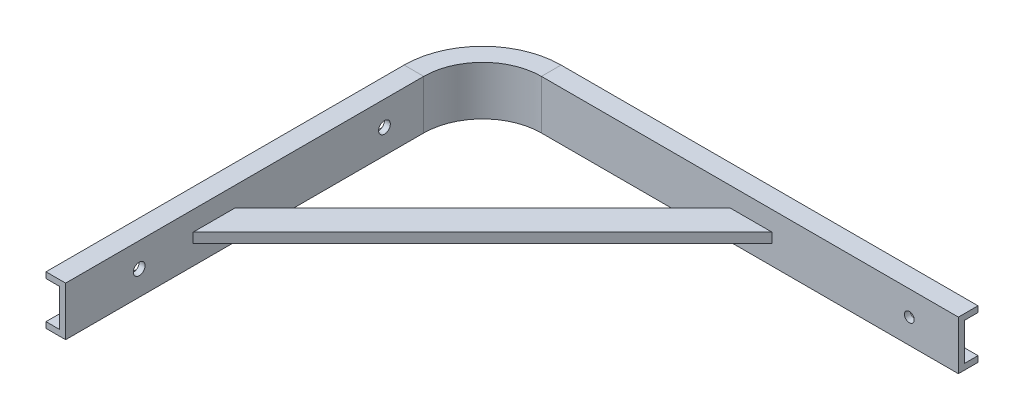
ISO-10303-21;
HEADER;
FILE_DESCRIPTION(('STEP AP214'),'2;1');
FILE_NAME('part.step','',(''),(''),'','','');
FILE_SCHEMA(('AUTOMOTIVE_DESIGN { 1 0 10303 214 1 1 1 1 }'));
ENDSEC;
DATA;
#1=APPLICATION_CONTEXT('core data for automotive mechanical design processes');
#2=APPLICATION_PROTOCOL_DEFINITION('international standard','automotive_design',2000,#1);
#3=PRODUCT_CONTEXT('',#1,'mechanical');
#4=PRODUCT('Part','Part','',(#3));
#5=PRODUCT_RELATED_PRODUCT_CATEGORY('part','',(#4));
#6=PRODUCT_DEFINITION_FORMATION('','',#4);
#7=PRODUCT_DEFINITION_CONTEXT('part definition',#1,'design');
#8=PRODUCT_DEFINITION('design','',#6,#7);
#9=PRODUCT_DEFINITION_SHAPE('','',#8);
#10=(LENGTH_UNIT() NAMED_UNIT(*) SI_UNIT(.MILLI.,.METRE.));
#11=(NAMED_UNIT(*) PLANE_ANGLE_UNIT() SI_UNIT($,.RADIAN.));
#12=(NAMED_UNIT(*) SI_UNIT($,.STERADIAN.) SOLID_ANGLE_UNIT());
#13=UNCERTAINTY_MEASURE_WITH_UNIT(LENGTH_MEASURE(1.E-05),#10,'distance_accuracy_value','');
#14=(GEOMETRIC_REPRESENTATION_CONTEXT(3) GLOBAL_UNCERTAINTY_ASSIGNED_CONTEXT((#13)) GLOBAL_UNIT_ASSIGNED_CONTEXT((#10,
#11,#12)) REPRESENTATION_CONTEXT('',''));
#15=CARTESIAN_POINT('',(0.,0.,0.));
#16=DIRECTION('',(0.,0.,1.));
#17=DIRECTION('',(1.,0.,0.));
#18=AXIS2_PLACEMENT_3D('',#15,#16,#17);
#19=CARTESIAN_POINT('',(-242.51106428109,-12.4999999999999,-227.488935718911));
#20=DIRECTION('',(-1.,0.,0.));
#21=DIRECTION('',(0.,0.,1.));
#22=AXIS2_PLACEMENT_3D('',#19,#20,#21);
#23=PLANE('',#22);
#24=CARTESIAN_POINT('',(-242.51106428109,0.,60.0000000000008));
#25=DIRECTION('',(1.,0.,0.));
#26=DIRECTION('',(0.,0.,-1.));
#27=AXIS2_PLACEMENT_3D('',#24,#25,#26);
#28=CIRCLE('',#27,3.00000000000001);
#29=CARTESIAN_POINT('',(-242.51106428109,0.,57.0000000000008));
#30=VERTEX_POINT('',#29);
#31=EDGE_CURVE('E271',#30,#30,#28,.T.);
#32=ORIENTED_EDGE('',*,*,#31,.F.);
#33=EDGE_LOOP('',(#32));
#34=FACE_BOUND('',#33,.T.);
#35=DIRECTION('',(0.,-1.,0.));
#36=VECTOR('',#35,1.);
#37=CARTESIAN_POINT('',(-242.511064281089,-12.4999999999999,40.0000000000001));
#38=LINE('',#37,#36);
#39=CARTESIAN_POINT('',(-242.511064281089,12.5,40.0000000000001));
#40=VERTEX_POINT('',#39);
#41=CARTESIAN_POINT('',(-242.511064281089,-12.5,40.0000000000001));
#42=VERTEX_POINT('',#41);
#43=EDGE_CURVE('E347',#40,#42,#38,.T.);
#44=ORIENTED_EDGE('',*,*,#43,.F.);
#45=DIRECTION('',(0.,0.,1.));
#46=VECTOR('',#45,1.);
#47=CARTESIAN_POINT('',(-242.51106428109,12.4999999999999,-227.488935718911));
#48=LINE('',#47,#46);
#49=CARTESIAN_POINT('',(-242.511064281089,12.5,222.511064281089));
#50=VERTEX_POINT('',#49);
#51=EDGE_CURVE('E329',#40,#50,#48,.T.);
#52=ORIENTED_EDGE('',*,*,#51,.T.);
#53=DIRECTION('',(0.,-1.,0.));
#54=VECTOR('',#53,1.);
#55=CARTESIAN_POINT('',(-242.511064281089,12.5,222.511064281089));
#56=LINE('',#55,#54);
#57=CARTESIAN_POINT('',(-242.511064281089,-12.5,222.511064281089));
#58=VERTEX_POINT('',#57);
#59=EDGE_CURVE('E326',#50,#58,#56,.T.);
#60=ORIENTED_EDGE('',*,*,#59,.T.);
#61=DIRECTION('',(0.,0.,-1.));
#62=VECTOR('',#61,1.);
#63=CARTESIAN_POINT('',(-242.51106428109,-12.4999999999999,-227.488935718911));
#64=LINE('',#63,#62);
#65=EDGE_CURVE('E328',#58,#42,#64,.T.);
#66=ORIENTED_EDGE('',*,*,#65,.T.);
#67=EDGE_LOOP('',(#44,#52,#60,#66));
#68=FACE_BOUND('',#67,.T.);
#69=CARTESIAN_POINT('',(-242.511064281089,0.,185.000000000001));
#70=DIRECTION('',(1.,0.,0.));
#71=DIRECTION('',(0.,0.,-1.));
#72=AXIS2_PLACEMENT_3D('',#69,#70,#71);
#73=CIRCLE('',#72,2.99999999999999);
#74=CARTESIAN_POINT('',(-242.511064281089,0.,182.000000000001));
#75=VERTEX_POINT('',#74);
#76=EDGE_CURVE('E274',#75,#75,#73,.T.);
#77=ORIENTED_EDGE('',*,*,#76,.F.);
#78=EDGE_LOOP('',(#77));
#79=FACE_BOUND('',#78,.T.);
#80=DIRECTION('',(0.,0.,1.));
#81=VECTOR('',#80,1.);
#82=CARTESIAN_POINT('',(-242.511064281089,2.5,157.511064281089));
#83=LINE('',#82,#81);
#84=CARTESIAN_POINT('',(-242.511064281089,2.5,136.297860845493));
#85=VERTEX_POINT('',#84);
#86=CARTESIAN_POINT('',(-242.511064281089,2.5,157.511064281089));
#87=VERTEX_POINT('',#86);
#88=EDGE_CURVE('E194',#85,#87,#83,.T.);
#89=ORIENTED_EDGE('',*,*,#88,.F.);
#90=DIRECTION('',(0.,-1.,0.));
#91=VECTOR('',#90,1.);
#92=CARTESIAN_POINT('',(-242.511064281089,2.5,136.297860845493));
#93=LINE('',#92,#91);
#94=CARTESIAN_POINT('',(-242.511064281089,-2.5,136.297860845493));
#95=VERTEX_POINT('',#94);
#96=EDGE_CURVE('E450',#85,#95,#93,.T.);
#97=ORIENTED_EDGE('',*,*,#96,.T.);
#98=DIRECTION('',(0.,0.,1.));
#99=VECTOR('',#98,1.);
#100=CARTESIAN_POINT('',(-242.511064281089,-2.5,157.511064281089));
#101=LINE('',#100,#99);
#102=CARTESIAN_POINT('',(-242.511064281089,-2.5,157.511064281089));
#103=VERTEX_POINT('',#102);
#104=EDGE_CURVE('E205',#95,#103,#101,.T.);
#105=ORIENTED_EDGE('',*,*,#104,.T.);
#106=DIRECTION('',(0.,-1.,0.));
#107=VECTOR('',#106,1.);
#108=CARTESIAN_POINT('',(-242.511064281089,2.5,157.511064281089));
#109=LINE('',#108,#107);
#110=EDGE_CURVE('E65',#87,#103,#109,.T.);
#111=ORIENTED_EDGE('',*,*,#110,.F.);
#112=EDGE_LOOP('',(#89,#97,#105,#111));
#113=FACE_BOUND('',#112,.T.);
#114=ADVANCED_FACE('F48',(#34,#68,#79,#113),#23,.F.);
#115=CARTESIAN_POINT('',(0.,-12.4999999999999,10.));
#116=DIRECTION('',(0.,0.,-1.));
#117=DIRECTION('',(-1.,0.,0.));
#118=AXIS2_PLACEMENT_3D('',#115,#116,#117);
#119=PLANE('',#118);
#120=DIRECTION('',(-1.,0.,0.));
#121=VECTOR('',#120,1.);
#122=CARTESIAN_POINT('',(0.,12.4999999999999,10.));
#123=LINE('',#122,#121);
#124=CARTESIAN_POINT('',(0.,12.4999999999999,10.));
#125=VERTEX_POINT('',#124);
#126=CARTESIAN_POINT('',(-212.511064281089,12.5,9.99999999999999));
#127=VERTEX_POINT('',#126);
#128=EDGE_CURVE('E313',#125,#127,#123,.T.);
#129=ORIENTED_EDGE('',*,*,#128,.T.);
#130=DIRECTION('',(0.,-1.,0.));
#131=VECTOR('',#130,1.);
#132=CARTESIAN_POINT('',(-212.511064281089,-12.4999999999999,10.));
#133=LINE('',#132,#131);
#134=CARTESIAN_POINT('',(-212.511064281089,-12.5,9.99999999999999));
#135=VERTEX_POINT('',#134);
#136=EDGE_CURVE('E310',#127,#135,#133,.T.);
#137=ORIENTED_EDGE('',*,*,#136,.T.);
#138=DIRECTION('',(1.,0.,0.));
#139=VECTOR('',#138,1.);
#140=CARTESIAN_POINT('',(0.,-12.4999999999999,10.));
#141=LINE('',#140,#139);
#142=CARTESIAN_POINT('',(0.,-12.4999999999999,10.));
#143=VERTEX_POINT('',#142);
#144=EDGE_CURVE('E308',#135,#143,#141,.T.);
#145=ORIENTED_EDGE('',*,*,#144,.T.);
#146=DIRECTION('',(0.,1.,0.));
#147=VECTOR('',#146,1.);
#148=CARTESIAN_POINT('',(0.,12.4999999999999,10.));
#149=LINE('',#148,#147);
#150=EDGE_CURVE('E305',#143,#125,#149,.T.);
#151=ORIENTED_EDGE('',*,*,#150,.T.);
#152=EDGE_LOOP('',(#129,#137,#145,#151));
#153=FACE_BOUND('',#152,.T.);
#154=CARTESIAN_POINT('',(-25.,0.,10.));
#155=DIRECTION('',(0.,0.,1.));
#156=DIRECTION('',(1.,0.,0.));
#157=AXIS2_PLACEMENT_3D('',#154,#155,#156);
#158=CIRCLE('',#157,2.5);
#159=CARTESIAN_POINT('',(-22.5,0.,10.));
#160=VERTEX_POINT('',#159);
#161=EDGE_CURVE('E268',#160,#160,#158,.T.);
#162=ORIENTED_EDGE('',*,*,#161,.F.);
#163=EDGE_LOOP('',(#162));
#164=FACE_BOUND('',#163,.T.);
#165=DIRECTION('',(-1.,0.,0.));
#166=VECTOR('',#165,1.);
#167=CARTESIAN_POINT('',(-116.213203435594,2.5,10.));
#168=LINE('',#167,#166);
#169=CARTESIAN_POINT('',(-94.9999999999973,2.5,10.));
#170=VERTEX_POINT('',#169);
#171=CARTESIAN_POINT('',(-116.213203435594,2.5,10.));
#172=VERTEX_POINT('',#171);
#173=EDGE_CURVE('E193',#170,#172,#168,.T.);
#174=ORIENTED_EDGE('',*,*,#173,.F.);
#175=DIRECTION('',(0.,-1.,0.));
#176=VECTOR('',#175,1.);
#177=CARTESIAN_POINT('',(-94.9999999999973,2.5,10.));
#178=LINE('',#177,#176);
#179=CARTESIAN_POINT('',(-94.9999999999973,-2.5,10.));
#180=VERTEX_POINT('',#179);
#181=EDGE_CURVE('E190',#170,#180,#178,.T.);
#182=ORIENTED_EDGE('',*,*,#181,.T.);
#183=DIRECTION('',(-1.,0.,0.));
#184=VECTOR('',#183,1.);
#185=CARTESIAN_POINT('',(-116.213203435594,-2.5,10.));
#186=LINE('',#185,#184);
#187=CARTESIAN_POINT('',(-116.213203435594,-2.5,10.));
#188=VERTEX_POINT('',#187);
#189=EDGE_CURVE('E456',#180,#188,#186,.T.);
#190=ORIENTED_EDGE('',*,*,#189,.T.);
#191=DIRECTION('',(0.,-1.,0.));
#192=VECTOR('',#191,1.);
#193=CARTESIAN_POINT('',(-116.213203435594,2.5,10.));
#194=LINE('',#193,#192);
#195=EDGE_CURVE('E210',#172,#188,#194,.T.);
#196=ORIENTED_EDGE('',*,*,#195,.F.);
#197=EDGE_LOOP('',(#174,#182,#190,#196));
#198=FACE_BOUND('',#197,.T.);
#199=ADVANCED_FACE('F441',(#153,#164,#198),#119,.F.);
#200=CARTESIAN_POINT('',(-252.51106428109,-12.4999999999999,-227.488935718911));
#201=DIRECTION('',(-1.,0.,0.));
#202=DIRECTION('',(0.,0.,1.));
#203=AXIS2_PLACEMENT_3D('',#200,#201,#202);
#204=PLANE('',#203);
#205=DIRECTION('',(0.,-1.,0.));
#206=VECTOR('',#205,1.);
#207=CARTESIAN_POINT('',(-252.511064281089,12.5,222.511064281089));
#208=LINE('',#207,#206);
#209=CARTESIAN_POINT('',(-252.511064281089,-9.5,222.511064281089));
#210=VERTEX_POINT('',#209);
#211=CARTESIAN_POINT('',(-252.511064281089,-12.5,222.511064281089));
#212=VERTEX_POINT('',#211);
#213=EDGE_CURVE('E334',#210,#212,#208,.T.);
#214=ORIENTED_EDGE('',*,*,#213,.F.);
#215=DIRECTION('',(0.,0.,1.));
#216=VECTOR('',#215,1.);
#217=CARTESIAN_POINT('',(-252.511064281089,-9.5,40.0000000000001));
#218=LINE('',#217,#216);
#219=CARTESIAN_POINT('',(-252.511064281089,-9.5,40.0000000000001));
#220=VERTEX_POINT('',#219);
#221=EDGE_CURVE('E208',#220,#210,#218,.T.);
#222=ORIENTED_EDGE('',*,*,#221,.F.);
#223=DIRECTION('',(0.,-1.,0.));
#224=VECTOR('',#223,1.);
#225=CARTESIAN_POINT('',(-252.511064281089,-12.4999999999999,40.0000000000001));
#226=LINE('',#225,#224);
#227=CARTESIAN_POINT('',(-252.511064281089,-12.5,40.0000000000002));
#228=VERTEX_POINT('',#227);
#229=EDGE_CURVE('E57',#220,#228,#226,.T.);
#230=ORIENTED_EDGE('',*,*,#229,.T.);
#231=DIRECTION('',(0.,0.,-1.));
#232=VECTOR('',#231,1.);
#233=CARTESIAN_POINT('',(-252.51106428109,-12.4999999999999,-227.488935718911));
#234=LINE('',#233,#232);
#235=EDGE_CURVE('E333',#212,#228,#234,.T.);
#236=ORIENTED_EDGE('',*,*,#235,.F.);
#237=EDGE_LOOP('',(#214,#222,#230,#236));
#238=FACE_BOUND('',#237,.T.);
#239=ADVANCED_FACE('F415',(#238),#204,.T.);
#240=CARTESIAN_POINT('',(0.,-12.4999999999999,0.));
#241=DIRECTION('',(0.,0.,-1.));
#242=DIRECTION('',(-1.,0.,0.));
#243=AXIS2_PLACEMENT_3D('',#240,#241,#242);
#244=PLANE('',#243);
#245=DIRECTION('',(0.,-1.,0.));
#246=VECTOR('',#245,1.);
#247=CARTESIAN_POINT('',(-212.511064281089,-12.4999999999999,0.));
#248=LINE('',#247,#246);
#249=CARTESIAN_POINT('',(-212.511064281089,-9.50000000000001,0.));
#250=VERTEX_POINT('',#249);
#251=CARTESIAN_POINT('',(-212.511064281089,-12.5,0.));
#252=VERTEX_POINT('',#251);
#253=EDGE_CURVE('E281',#250,#252,#248,.T.);
#254=ORIENTED_EDGE('',*,*,#253,.F.);
#255=DIRECTION('',(-1.,0.,0.));
#256=VECTOR('',#255,1.);
#257=CARTESIAN_POINT('',(0.,-9.5,0.));
#258=LINE('',#257,#256);
#259=CARTESIAN_POINT('',(0.,-9.5,0.));
#260=VERTEX_POINT('',#259);
#261=EDGE_CURVE('E229',#260,#250,#258,.T.);
#262=ORIENTED_EDGE('',*,*,#261,.F.);
#263=DIRECTION('',(0.,1.,0.));
#264=VECTOR('',#263,1.);
#265=CARTESIAN_POINT('',(0.,12.4999999999999,0.));
#266=LINE('',#265,#264);
#267=CARTESIAN_POINT('',(0.,-12.4999999999999,0.));
#268=VERTEX_POINT('',#267);
#269=EDGE_CURVE('E319',#268,#260,#266,.T.);
#270=ORIENTED_EDGE('',*,*,#269,.F.);
#271=DIRECTION('',(1.,0.,0.));
#272=VECTOR('',#271,1.);
#273=CARTESIAN_POINT('',(0.,-12.4999999999999,0.));
#274=LINE('',#273,#272);
#275=EDGE_CURVE('E300',#252,#268,#274,.T.);
#276=ORIENTED_EDGE('',*,*,#275,.F.);
#277=EDGE_LOOP('',(#254,#262,#270,#276));
#278=FACE_BOUND('',#277,.T.);
#279=ADVANCED_FACE('F431',(#278),#244,.T.);
#280=CARTESIAN_POINT('',(-212.511064281089,463.304835821445,40.));
#281=DIRECTION('',(0.,-1.,0.));
#282=DIRECTION('',(0.,0.,-1.));
#283=AXIS2_PLACEMENT_3D('',#280,#281,#282);
#284=CYLINDRICAL_SURFACE('',#283,40.);
#285=ORIENTED_EDGE('',*,*,#229,.F.);
#286=CARTESIAN_POINT('',(-212.511064281089,-9.5,40.));
#287=DIRECTION('',(0.,1.,0.));
#288=DIRECTION('',(0.,0.,1.));
#289=AXIS2_PLACEMENT_3D('',#286,#287,#288);
#290=CIRCLE('',#289,40.);
#291=EDGE_CURVE('E206',#250,#220,#290,.T.);
#292=ORIENTED_EDGE('',*,*,#291,.F.);
#293=ORIENTED_EDGE('',*,*,#253,.T.);
#294=CARTESIAN_POINT('',(-212.511064281089,-12.5,40.));
#295=DIRECTION('',(0.,-1.,0.));
#296=DIRECTION('',(0.,0.,-1.));
#297=AXIS2_PLACEMENT_3D('',#294,#295,#296);
#298=CIRCLE('',#297,40.);
#299=EDGE_CURVE('E278',#228,#252,#298,.T.);
#300=ORIENTED_EDGE('',*,*,#299,.F.);
#301=EDGE_LOOP('',(#285,#292,#293,#300));
#302=FACE_BOUND('',#301,.T.);
#303=ADVANCED_FACE('F425',(#302),#284,.T.);
#304=CARTESIAN_POINT('',(-252.511064281089,0.,185.000000000001));
#305=DIRECTION('',(1.,0.,0.));
#306=DIRECTION('',(0.,0.,-1.));
#307=AXIS2_PLACEMENT_3D('',#304,#305,#306);
#308=CYLINDRICAL_SURFACE('',#307,2.99999999999999);
#309=ORIENTED_EDGE('',*,*,#76,.T.);
#310=EDGE_LOOP('',(#309));
#311=FACE_BOUND('',#310,.T.);
#312=CARTESIAN_POINT('',(-245.511064281089,0.,185.000000000001));
#313=DIRECTION('',(-1.,0.,0.));
#314=DIRECTION('',(0.,0.,1.));
#315=AXIS2_PLACEMENT_3D('',#312,#313,#314);
#316=CIRCLE('',#315,2.99999999999999);
#317=CARTESIAN_POINT('',(-245.511064281089,0.,188.000000000001));
#318=VERTEX_POINT('',#317);
#319=EDGE_CURVE('E265',#318,#318,#316,.T.);
#320=ORIENTED_EDGE('',*,*,#319,.T.);
#321=EDGE_LOOP('',(#320));
#322=FACE_BOUND('',#321,.T.);
#323=ADVANCED_FACE('F497',(#311,#322),#308,.F.);
#324=CARTESIAN_POINT('',(-252.51106428109,0.,60.0000000000009));
#325=DIRECTION('',(1.,0.,0.));
#326=DIRECTION('',(0.,0.,-1.));
#327=AXIS2_PLACEMENT_3D('',#324,#325,#326);
#328=CYLINDRICAL_SURFACE('',#327,3.00000000000001);
#329=ORIENTED_EDGE('',*,*,#31,.T.);
#330=EDGE_LOOP('',(#329));
#331=FACE_BOUND('',#330,.T.);
#332=CARTESIAN_POINT('',(-245.511064281089,0.,60.0000000000009));
#333=DIRECTION('',(-1.,0.,0.));
#334=DIRECTION('',(0.,0.,1.));
#335=AXIS2_PLACEMENT_3D('',#332,#333,#334);
#336=CIRCLE('',#335,3.00000000000001);
#337=CARTESIAN_POINT('',(-245.511064281089,0.,63.0000000000009));
#338=VERTEX_POINT('',#337);
#339=EDGE_CURVE('E52',#338,#338,#336,.T.);
#340=ORIENTED_EDGE('',*,*,#339,.T.);
#341=EDGE_LOOP('',(#340));
#342=FACE_BOUND('',#341,.T.);
#343=ADVANCED_FACE('F361',(#331,#342),#328,.F.);
#344=CARTESIAN_POINT('',(-25.,0.,0.));
#345=DIRECTION('',(0.,0.,1.));
#346=DIRECTION('',(1.,0.,0.));
#347=AXIS2_PLACEMENT_3D('',#344,#345,#346);
#348=CYLINDRICAL_SURFACE('',#347,2.5);
#349=ORIENTED_EDGE('',*,*,#161,.T.);
#350=EDGE_LOOP('',(#349));
#351=FACE_BOUND('',#350,.T.);
#352=CARTESIAN_POINT('',(-25.,0.,7.));
#353=DIRECTION('',(0.,0.,-1.));
#354=DIRECTION('',(-1.,0.,0.));
#355=AXIS2_PLACEMENT_3D('',#352,#353,#354);
#356=CIRCLE('',#355,2.5);
#357=CARTESIAN_POINT('',(-27.5,0.,7.));
#358=VERTEX_POINT('',#357);
#359=EDGE_CURVE('E264',#358,#358,#356,.F.);
#360=ORIENTED_EDGE('',*,*,#359,.F.);
#361=EDGE_LOOP('',(#360));
#362=FACE_BOUND('',#361,.T.);
#363=ADVANCED_FACE('F481',(#351,#362),#348,.F.);
#364=DIRECTION('',(0.,0.,1.));
#365=VECTOR('',#364,1.);
#366=CARTESIAN_POINT('',(-252.511064281089,9.5,40.0000000000001));
#367=LINE('',#366,#365);
#368=CARTESIAN_POINT('',(-252.511064281089,9.5,40.0000000000001));
#369=VERTEX_POINT('',#368);
#370=CARTESIAN_POINT('',(-252.511064281089,9.5,222.511064281089));
#371=VERTEX_POINT('',#370);
#372=EDGE_CURVE('E234',#369,#371,#367,.T.);
#373=ORIENTED_EDGE('',*,*,#372,.T.);
#374=CARTESIAN_POINT('',(-252.511064281089,12.5,222.511064281089));
#375=VERTEX_POINT('',#374);
#376=EDGE_CURVE('E330',#375,#371,#208,.T.);
#377=ORIENTED_EDGE('',*,*,#376,.F.);
#378=DIRECTION('',(0.,0.,1.));
#379=VECTOR('',#378,1.);
#380=CARTESIAN_POINT('',(-252.51106428109,12.4999999999999,-227.488935718911));
#381=LINE('',#380,#379);
#382=CARTESIAN_POINT('',(-252.511064281089,12.5,40.0000000000001));
#383=VERTEX_POINT('',#382);
#384=EDGE_CURVE('E293',#383,#375,#381,.T.);
#385=ORIENTED_EDGE('',*,*,#384,.F.);
#386=EDGE_CURVE('E12',#383,#369,#226,.T.);
#387=ORIENTED_EDGE('',*,*,#386,.T.);
#388=EDGE_LOOP('',(#373,#377,#385,#387));
#389=FACE_BOUND('',#388,.T.);
#390=ADVANCED_FACE('F384',(#389),#204,.T.);
#391=CARTESIAN_POINT('',(-242.51106428109,12.4999999999999,-227.488935718911));
#392=DIRECTION('',(0.,-1.,0.));
#393=DIRECTION('',(0.,0.,-1.));
#394=AXIS2_PLACEMENT_3D('',#391,#392,#393);
#395=PLANE('',#394);
#396=DIRECTION('',(1.,0.,0.));
#397=VECTOR('',#396,1.);
#398=CARTESIAN_POINT('',(-242.511064281089,12.5,40.0000000000001));
#399=LINE('',#398,#397);
#400=EDGE_CURVE('E341',#383,#40,#399,.T.);
#401=ORIENTED_EDGE('',*,*,#400,.F.);
#402=ORIENTED_EDGE('',*,*,#384,.T.);
#403=DIRECTION('',(-1.,0.,0.));
#404=VECTOR('',#403,1.);
#405=CARTESIAN_POINT('',(-242.511064281089,12.5,222.511064281089));
#406=LINE('',#405,#404);
#407=EDGE_CURVE('E338',#50,#375,#406,.T.);
#408=ORIENTED_EDGE('',*,*,#407,.F.);
#409=ORIENTED_EDGE('',*,*,#51,.F.);
#410=EDGE_LOOP('',(#401,#402,#408,#409));
#411=FACE_BOUND('',#410,.T.);
#412=ADVANCED_FACE('F50',(#411),#395,.F.);
#413=CARTESIAN_POINT('',(-242.511064281089,12.5,222.511064281089));
#414=DIRECTION('',(0.,0.,-1.));
#415=DIRECTION('',(-1.,0.,0.));
#416=AXIS2_PLACEMENT_3D('',#413,#414,#415);
#417=PLANE('',#416);
#418=ORIENTED_EDGE('',*,*,#376,.T.);
#419=DIRECTION('',(1.,0.,0.));
#420=VECTOR('',#419,1.);
#421=CARTESIAN_POINT('',(-245.511064281089,9.5,222.511064281089));
#422=LINE('',#421,#420);
#423=CARTESIAN_POINT('',(-245.511064281089,9.5,222.511064281089));
#424=VERTEX_POINT('',#423);
#425=EDGE_CURVE('E237',#371,#424,#422,.T.);
#426=ORIENTED_EDGE('',*,*,#425,.T.);
#427=DIRECTION('',(0.,-1.,0.));
#428=VECTOR('',#427,1.);
#429=CARTESIAN_POINT('',(-245.511064281089,9.5,222.511064281089));
#430=LINE('',#429,#428);
#431=CARTESIAN_POINT('',(-245.511064281089,-9.5,222.511064281089));
#432=VERTEX_POINT('',#431);
#433=EDGE_CURVE('E261',#424,#432,#430,.T.);
#434=ORIENTED_EDGE('',*,*,#433,.T.);
#435=DIRECTION('',(1.,0.,0.));
#436=VECTOR('',#435,1.);
#437=CARTESIAN_POINT('',(-245.511064281089,-9.5,222.511064281089));
#438=LINE('',#437,#436);
#439=EDGE_CURVE('E215',#210,#432,#438,.T.);
#440=ORIENTED_EDGE('',*,*,#439,.F.);
#441=ORIENTED_EDGE('',*,*,#213,.T.);
#442=DIRECTION('',(-1.,0.,0.));
#443=VECTOR('',#442,1.);
#444=CARTESIAN_POINT('',(-242.511064281089,-12.5,222.511064281089));
#445=LINE('',#444,#443);
#446=EDGE_CURVE('E335',#58,#212,#445,.T.);
#447=ORIENTED_EDGE('',*,*,#446,.F.);
#448=ORIENTED_EDGE('',*,*,#59,.F.);
#449=ORIENTED_EDGE('',*,*,#407,.T.);
#450=EDGE_LOOP('',(#418,#426,#434,#440,#441,#447,#448,#449));
#451=FACE_BOUND('',#450,.T.);
#452=ADVANCED_FACE('F378',(#451),#417,.F.);
#453=CARTESIAN_POINT('',(-242.51106428109,-12.4999999999999,-227.488935718911));
#454=DIRECTION('',(0.,1.,0.));
#455=DIRECTION('',(0.,0.,1.));
#456=AXIS2_PLACEMENT_3D('',#453,#454,#455);
#457=PLANE('',#456);
#458=DIRECTION('',(-1.,0.,0.));
#459=VECTOR('',#458,1.);
#460=CARTESIAN_POINT('',(-242.511064281089,-12.5,40.0000000000001));
#461=LINE('',#460,#459);
#462=EDGE_CURVE('E344',#42,#228,#461,.T.);
#463=ORIENTED_EDGE('',*,*,#462,.F.);
#464=ORIENTED_EDGE('',*,*,#65,.F.);
#465=ORIENTED_EDGE('',*,*,#446,.T.);
#466=ORIENTED_EDGE('',*,*,#235,.T.);
#467=EDGE_LOOP('',(#463,#464,#465,#466));
#468=FACE_BOUND('',#467,.T.);
#469=ADVANCED_FACE('F418',(#468),#457,.F.);
#470=CARTESIAN_POINT('',(0.,12.4999999999999,10.));
#471=DIRECTION('',(-1.,0.,0.));
#472=DIRECTION('',(0.,0.,1.));
#473=AXIS2_PLACEMENT_3D('',#470,#471,#472);
#474=PLANE('',#473);
#475=DIRECTION('',(0.,-1.,0.));
#476=VECTOR('',#475,1.);
#477=CARTESIAN_POINT('',(0.,9.5,7.));
#478=LINE('',#477,#476);
#479=CARTESIAN_POINT('',(0.,9.5,7.));
#480=VERTEX_POINT('',#479);
#481=CARTESIAN_POINT('',(0.,-9.5,7.));
#482=VERTEX_POINT('',#481);
#483=EDGE_CURVE('E253',#480,#482,#478,.T.);
#484=ORIENTED_EDGE('',*,*,#483,.F.);
#485=DIRECTION('',(0.,0.,-1.));
#486=VECTOR('',#485,1.);
#487=CARTESIAN_POINT('',(0.,9.5,0.));
#488=LINE('',#487,#486);
#489=CARTESIAN_POINT('',(0.,9.5,0.));
#490=VERTEX_POINT('',#489);
#491=EDGE_CURVE('E245',#480,#490,#488,.T.);
#492=ORIENTED_EDGE('',*,*,#491,.T.);
#493=CARTESIAN_POINT('',(0.,12.4999999999999,0.));
#494=VERTEX_POINT('',#493);
#495=EDGE_CURVE('E322',#490,#494,#266,.T.);
#496=ORIENTED_EDGE('',*,*,#495,.T.);
#497=DIRECTION('',(0.,0.,-1.));
#498=VECTOR('',#497,1.);
#499=CARTESIAN_POINT('',(0.,12.4999999999999,10.));
#500=LINE('',#499,#498);
#501=EDGE_CURVE('E290',#125,#494,#500,.T.);
#502=ORIENTED_EDGE('',*,*,#501,.F.);
#503=ORIENTED_EDGE('',*,*,#150,.F.);
#504=DIRECTION('',(0.,0.,-1.));
#505=VECTOR('',#504,1.);
#506=CARTESIAN_POINT('',(0.,-12.4999999999999,10.));
#507=LINE('',#506,#505);
#508=EDGE_CURVE('E316',#143,#268,#507,.T.);
#509=ORIENTED_EDGE('',*,*,#508,.T.);
#510=ORIENTED_EDGE('',*,*,#269,.T.);
#511=DIRECTION('',(0.,0.,-1.));
#512=VECTOR('',#511,1.);
#513=CARTESIAN_POINT('',(0.,-9.5,0.));
#514=LINE('',#513,#512);
#515=EDGE_CURVE('E227',#482,#260,#514,.T.);
#516=ORIENTED_EDGE('',*,*,#515,.F.);
#517=EDGE_LOOP('',(#484,#492,#496,#502,#503,#509,#510,#516));
#518=FACE_BOUND('',#517,.T.);
#519=ADVANCED_FACE('F400',(#518),#474,.F.);
#520=CARTESIAN_POINT('',(0.,-12.4999999999999,10.));
#521=DIRECTION('',(0.,1.,0.));
#522=DIRECTION('',(-1.,0.,0.));
#523=AXIS2_PLACEMENT_3D('',#520,#521,#522);
#524=PLANE('',#523);
#525=ORIENTED_EDGE('',*,*,#144,.F.);
#526=DIRECTION('',(0.,0.,-1.));
#527=VECTOR('',#526,1.);
#528=CARTESIAN_POINT('',(-212.511064281089,-12.5,10.));
#529=LINE('',#528,#527);
#530=EDGE_CURVE('E302',#135,#252,#529,.T.);
#531=ORIENTED_EDGE('',*,*,#530,.T.);
#532=ORIENTED_EDGE('',*,*,#275,.T.);
#533=ORIENTED_EDGE('',*,*,#508,.F.);
#534=EDGE_LOOP('',(#525,#531,#532,#533));
#535=FACE_BOUND('',#534,.T.);
#536=ADVANCED_FACE('F436',(#535),#524,.F.);
#537=DIRECTION('',(-1.,0.,0.));
#538=VECTOR('',#537,1.);
#539=CARTESIAN_POINT('',(0.,9.5,0.));
#540=LINE('',#539,#538);
#541=CARTESIAN_POINT('',(-212.511064281089,9.5,0.));
#542=VERTEX_POINT('',#541);
#543=EDGE_CURVE('E250',#490,#542,#540,.T.);
#544=ORIENTED_EDGE('',*,*,#543,.T.);
#545=CARTESIAN_POINT('',(-212.511064281089,12.5,0.));
#546=VERTEX_POINT('',#545);
#547=EDGE_CURVE('E323',#546,#542,#248,.T.);
#548=ORIENTED_EDGE('',*,*,#547,.F.);
#549=DIRECTION('',(-1.,0.,0.));
#550=VECTOR('',#549,1.);
#551=CARTESIAN_POINT('',(0.,12.4999999999999,0.));
#552=LINE('',#551,#550);
#553=EDGE_CURVE('E297',#494,#546,#552,.T.);
#554=ORIENTED_EDGE('',*,*,#553,.F.);
#555=ORIENTED_EDGE('',*,*,#495,.F.);
#556=EDGE_LOOP('',(#544,#548,#554,#555));
#557=FACE_BOUND('',#556,.T.);
#558=ADVANCED_FACE('F392',(#557),#244,.T.);
#559=CARTESIAN_POINT('',(0.,12.4999999999999,10.));
#560=DIRECTION('',(0.,-1.,0.));
#561=DIRECTION('',(1.,0.,0.));
#562=AXIS2_PLACEMENT_3D('',#559,#560,#561);
#563=PLANE('',#562);
#564=ORIENTED_EDGE('',*,*,#553,.T.);
#565=DIRECTION('',(0.,0.,1.));
#566=VECTOR('',#565,1.);
#567=CARTESIAN_POINT('',(-212.511064281089,12.5,10.));
#568=LINE('',#567,#566);
#569=EDGE_CURVE('E294',#546,#127,#568,.T.);
#570=ORIENTED_EDGE('',*,*,#569,.T.);
#571=ORIENTED_EDGE('',*,*,#128,.F.);
#572=ORIENTED_EDGE('',*,*,#501,.T.);
#573=EDGE_LOOP('',(#564,#570,#571,#572));
#574=FACE_BOUND('',#573,.T.);
#575=ADVANCED_FACE('F395',(#574),#563,.F.);
#576=CARTESIAN_POINT('',(-212.511064281089,12.5,40.));
#577=DIRECTION('',(0.,-1.,0.));
#578=DIRECTION('',(1.,0.,0.));
#579=AXIS2_PLACEMENT_3D('',#576,#577,#578);
#580=PLANE('',#579);
#581=ORIENTED_EDGE('',*,*,#400,.T.);
#582=CARTESIAN_POINT('',(-212.511064281089,12.5,40.));
#583=DIRECTION('',(0.,-1.,0.));
#584=DIRECTION('',(0.,0.,-1.));
#585=AXIS2_PLACEMENT_3D('',#582,#583,#584);
#586=CIRCLE('',#585,30.);
#587=EDGE_CURVE('E277',#127,#40,#586,.F.);
#588=ORIENTED_EDGE('',*,*,#587,.F.);
#589=ORIENTED_EDGE('',*,*,#569,.F.);
#590=CARTESIAN_POINT('',(-212.511064281089,12.5,40.));
#591=DIRECTION('',(0.,-1.,0.));
#592=DIRECTION('',(0.,0.,-1.));
#593=AXIS2_PLACEMENT_3D('',#590,#591,#592);
#594=CIRCLE('',#593,40.);
#595=EDGE_CURVE('E282',#546,#383,#594,.F.);
#596=ORIENTED_EDGE('',*,*,#595,.T.);
#597=EDGE_LOOP('',(#581,#588,#589,#596));
#598=FACE_BOUND('',#597,.T.);
#599=ADVANCED_FACE('F505',(#598),#580,.F.);
#600=CARTESIAN_POINT('',(-212.511064281089,-12.5,40.));
#601=DIRECTION('',(0.,1.,0.));
#602=DIRECTION('',(-1.,0.,0.));
#603=AXIS2_PLACEMENT_3D('',#600,#601,#602);
#604=PLANE('',#603);
#605=ORIENTED_EDGE('',*,*,#530,.F.);
#606=CARTESIAN_POINT('',(-212.511064281089,-12.5,40.));
#607=DIRECTION('',(0.,-1.,0.));
#608=DIRECTION('',(0.,0.,-1.));
#609=AXIS2_PLACEMENT_3D('',#606,#607,#608);
#610=CIRCLE('',#609,30.);
#611=EDGE_CURVE('E285',#42,#135,#610,.T.);
#612=ORIENTED_EDGE('',*,*,#611,.F.);
#613=ORIENTED_EDGE('',*,*,#462,.T.);
#614=ORIENTED_EDGE('',*,*,#299,.T.);
#615=EDGE_LOOP('',(#605,#612,#613,#614));
#616=FACE_BOUND('',#615,.T.);
#617=ADVANCED_FACE('F423',(#616),#604,.F.);
#618=CARTESIAN_POINT('',(-212.511064281089,9.5,40.));
#619=DIRECTION('',(0.,1.,0.));
#620=DIRECTION('',(0.,0.,1.));
#621=AXIS2_PLACEMENT_3D('',#618,#619,#620);
#622=CIRCLE('',#621,40.);
#623=EDGE_CURVE('E231',#542,#369,#622,.T.);
#624=ORIENTED_EDGE('',*,*,#623,.T.);
#625=ORIENTED_EDGE('',*,*,#386,.F.);
#626=ORIENTED_EDGE('',*,*,#595,.F.);
#627=ORIENTED_EDGE('',*,*,#547,.T.);
#628=EDGE_LOOP('',(#624,#625,#626,#627));
#629=FACE_BOUND('',#628,.T.);
#630=ADVANCED_FACE('F387',(#629),#284,.T.);
#631=CARTESIAN_POINT('',(-212.511064281089,463.304835821445,40.));
#632=DIRECTION('',(0.,-1.,0.));
#633=DIRECTION('',(0.,0.,-1.));
#634=AXIS2_PLACEMENT_3D('',#631,#632,#633);
#635=CYLINDRICAL_SURFACE('',#634,30.);
#636=ORIENTED_EDGE('',*,*,#611,.T.);
#637=ORIENTED_EDGE('',*,*,#136,.F.);
#638=ORIENTED_EDGE('',*,*,#587,.T.);
#639=ORIENTED_EDGE('',*,*,#43,.T.);
#640=EDGE_LOOP('',(#636,#637,#638,#639));
#641=FACE_BOUND('',#640,.T.);
#642=ADVANCED_FACE('F438',(#641),#635,.F.);
#643=CARTESIAN_POINT('',(0.,9.5,7.));
#644=DIRECTION('',(0.,0.,-1.));
#645=DIRECTION('',(-1.,0.,0.));
#646=AXIS2_PLACEMENT_3D('',#643,#644,#645);
#647=PLANE('',#646);
#648=DIRECTION('',(0.,-1.,0.));
#649=VECTOR('',#648,1.);
#650=CARTESIAN_POINT('',(-212.511064281089,9.5,7.));
#651=LINE('',#650,#649);
#652=CARTESIAN_POINT('',(-212.511064281089,9.5,7.));
#653=VERTEX_POINT('',#652);
#654=CARTESIAN_POINT('',(-212.511064281089,-9.5,7.));
#655=VERTEX_POINT('',#654);
#656=EDGE_CURVE('E257',#653,#655,#651,.T.);
#657=ORIENTED_EDGE('',*,*,#656,.F.);
#658=DIRECTION('',(1.,0.,0.));
#659=VECTOR('',#658,1.);
#660=CARTESIAN_POINT('',(0.,9.5,7.));
#661=LINE('',#660,#659);
#662=EDGE_CURVE('E244',#653,#480,#661,.T.);
#663=ORIENTED_EDGE('',*,*,#662,.T.);
#664=ORIENTED_EDGE('',*,*,#483,.T.);
#665=DIRECTION('',(1.,0.,0.));
#666=VECTOR('',#665,1.);
#667=CARTESIAN_POINT('',(0.,-9.5,7.));
#668=LINE('',#667,#666);
#669=EDGE_CURVE('E224',#655,#482,#668,.T.);
#670=ORIENTED_EDGE('',*,*,#669,.F.);
#671=EDGE_LOOP('',(#657,#663,#664,#670));
#672=FACE_BOUND('',#671,.T.);
#673=ORIENTED_EDGE('',*,*,#359,.T.);
#674=EDGE_LOOP('',(#673));
#675=FACE_BOUND('',#674,.T.);
#676=ADVANCED_FACE('F367',(#672,#675),#647,.T.);
#677=CARTESIAN_POINT('',(-245.511064281089,9.5,40.0000000000001));
#678=DIRECTION('',(-1.,0.,0.));
#679=DIRECTION('',(0.,0.,1.));
#680=AXIS2_PLACEMENT_3D('',#677,#678,#679);
#681=PLANE('',#680);
#682=ORIENTED_EDGE('',*,*,#319,.F.);
#683=EDGE_LOOP('',(#682));
#684=FACE_BOUND('',#683,.T.);
#685=ORIENTED_EDGE('',*,*,#339,.F.);
#686=EDGE_LOOP('',(#685));
#687=FACE_BOUND('',#686,.T.);
#688=ORIENTED_EDGE('',*,*,#433,.F.);
#689=DIRECTION('',(0.,0.,-1.));
#690=VECTOR('',#689,1.);
#691=CARTESIAN_POINT('',(-245.511064281089,9.5,40.0000000000001));
#692=LINE('',#691,#690);
#693=CARTESIAN_POINT('',(-245.511064281089,9.5,40.0000000000001));
#694=VERTEX_POINT('',#693);
#695=EDGE_CURVE('E240',#424,#694,#692,.T.);
#696=ORIENTED_EDGE('',*,*,#695,.T.);
#697=DIRECTION('',(0.,-1.,0.));
#698=VECTOR('',#697,1.);
#699=CARTESIAN_POINT('',(-245.511064281089,9.5,40.0000000000001));
#700=LINE('',#699,#698);
#701=CARTESIAN_POINT('',(-245.511064281089,-9.5,40.0000000000001));
#702=VERTEX_POINT('',#701);
#703=EDGE_CURVE('E259',#694,#702,#700,.T.);
#704=ORIENTED_EDGE('',*,*,#703,.T.);
#705=DIRECTION('',(0.,0.,-1.));
#706=VECTOR('',#705,1.);
#707=CARTESIAN_POINT('',(-245.511064281089,-9.5,40.0000000000001));
#708=LINE('',#707,#706);
#709=EDGE_CURVE('E218',#432,#702,#708,.T.);
#710=ORIENTED_EDGE('',*,*,#709,.F.);
#711=EDGE_LOOP('',(#688,#696,#704,#710));
#712=FACE_BOUND('',#711,.T.);
#713=ADVANCED_FACE('F363',(#684,#687,#712),#681,.T.);
#714=CARTESIAN_POINT('',(-212.511064281089,9.5,40.));
#715=DIRECTION('',(0.,-1.,0.));
#716=DIRECTION('',(0.,0.,-1.));
#717=AXIS2_PLACEMENT_3D('',#714,#715,#716);
#718=CYLINDRICAL_SURFACE('',#717,33.);
#719=ORIENTED_EDGE('',*,*,#703,.F.);
#720=CARTESIAN_POINT('',(-212.511064281089,9.5,40.));
#721=DIRECTION('',(0.,-1.,0.));
#722=DIRECTION('',(0.,0.,1.));
#723=AXIS2_PLACEMENT_3D('',#720,#721,#722);
#724=CIRCLE('',#723,33.);
#725=EDGE_CURVE('E242',#694,#653,#724,.T.);
#726=ORIENTED_EDGE('',*,*,#725,.T.);
#727=ORIENTED_EDGE('',*,*,#656,.T.);
#728=CARTESIAN_POINT('',(-212.511064281089,-9.5,40.));
#729=DIRECTION('',(0.,-1.,0.));
#730=DIRECTION('',(0.,0.,1.));
#731=AXIS2_PLACEMENT_3D('',#728,#729,#730);
#732=CIRCLE('',#731,33.);
#733=EDGE_CURVE('E221',#702,#655,#732,.T.);
#734=ORIENTED_EDGE('',*,*,#733,.F.);
#735=EDGE_LOOP('',(#719,#726,#727,#734));
#736=FACE_BOUND('',#735,.T.);
#737=ADVANCED_FACE('F366',(#736),#718,.T.);
#738=CARTESIAN_POINT('',(-212.511064281089,9.5,40.));
#739=DIRECTION('',(0.,1.,0.));
#740=DIRECTION('',(0.,0.,1.));
#741=AXIS2_PLACEMENT_3D('',#738,#739,#740);
#742=PLANE('',#741);
#743=ORIENTED_EDGE('',*,*,#623,.F.);
#744=ORIENTED_EDGE('',*,*,#543,.F.);
#745=ORIENTED_EDGE('',*,*,#491,.F.);
#746=ORIENTED_EDGE('',*,*,#662,.F.);
#747=ORIENTED_EDGE('',*,*,#725,.F.);
#748=ORIENTED_EDGE('',*,*,#695,.F.);
#749=ORIENTED_EDGE('',*,*,#425,.F.);
#750=ORIENTED_EDGE('',*,*,#372,.F.);
#751=EDGE_LOOP('',(#743,#744,#745,#746,#747,#748,#749,#750));
#752=FACE_BOUND('',#751,.T.);
#753=ADVANCED_FACE('F376',(#752),#742,.F.);
#754=CARTESIAN_POINT('',(-212.511064281089,-9.5,40.));
#755=DIRECTION('',(0.,1.,0.));
#756=DIRECTION('',(0.,0.,1.));
#757=AXIS2_PLACEMENT_3D('',#754,#755,#756);
#758=PLANE('',#757);
#759=ORIENTED_EDGE('',*,*,#291,.T.);
#760=ORIENTED_EDGE('',*,*,#221,.T.);
#761=ORIENTED_EDGE('',*,*,#439,.T.);
#762=ORIENTED_EDGE('',*,*,#709,.T.);
#763=ORIENTED_EDGE('',*,*,#733,.T.);
#764=ORIENTED_EDGE('',*,*,#669,.T.);
#765=ORIENTED_EDGE('',*,*,#515,.T.);
#766=ORIENTED_EDGE('',*,*,#261,.T.);
#767=EDGE_LOOP('',(#759,#760,#761,#762,#763,#764,#765,#766));
#768=FACE_BOUND('',#767,.T.);
#769=ADVANCED_FACE('F409',(#768),#758,.T.);
#770=CARTESIAN_POINT('',(-94.9999999999973,2.5,10.));
#771=DIRECTION('',(-0.707106781186541,0.,-0.707106781186554));
#772=DIRECTION('',(-0.707106781186554,0.,0.707106781186541));
#773=AXIS2_PLACEMENT_3D('',#770,#771,#772);
#774=PLANE('',#773);
#775=DIRECTION('',(0.707106781186554,0.,-0.707106781186541));
#776=VECTOR('',#775,1.);
#777=CARTESIAN_POINT('',(-94.9999999999973,-2.5,10.));
#778=LINE('',#777,#776);
#779=EDGE_CURVE('E454',#103,#180,#778,.T.);
#780=ORIENTED_EDGE('',*,*,#779,.T.);
#781=ORIENTED_EDGE('',*,*,#181,.F.);
#782=DIRECTION('',(0.707106781186554,0.,-0.707106781186541));
#783=VECTOR('',#782,1.);
#784=CARTESIAN_POINT('',(-94.9999999999973,2.5,10.));
#785=LINE('',#784,#783);
#786=EDGE_CURVE('E186',#87,#170,#785,.T.);
#787=ORIENTED_EDGE('',*,*,#786,.F.);
#788=ORIENTED_EDGE('',*,*,#110,.T.);
#789=EDGE_LOOP('',(#780,#781,#787,#788));
#790=FACE_BOUND('',#789,.T.);
#791=ADVANCED_FACE('F188',(#790),#774,.F.);
#792=CARTESIAN_POINT('',(-242.511064281089,2.5,136.297860845493));
#793=DIRECTION('',(0.707106781186541,0.,0.707106781186554));
#794=DIRECTION('',(0.707106781186554,0.,-0.707106781186541));
#795=AXIS2_PLACEMENT_3D('',#792,#793,#794);
#796=PLANE('',#795);
#797=DIRECTION('',(-0.707106781186554,0.,0.707106781186541));
#798=VECTOR('',#797,1.);
#799=CARTESIAN_POINT('',(-242.511064281089,-2.5,136.297860845493));
#800=LINE('',#799,#798);
#801=EDGE_CURVE('E73',#188,#95,#800,.T.);
#802=ORIENTED_EDGE('',*,*,#801,.T.);
#803=ORIENTED_EDGE('',*,*,#96,.F.);
#804=DIRECTION('',(-0.707106781186554,0.,0.707106781186541));
#805=VECTOR('',#804,1.);
#806=CARTESIAN_POINT('',(-242.511064281089,2.5,136.297860845493));
#807=LINE('',#806,#805);
#808=EDGE_CURVE('E199',#172,#85,#807,.T.);
#809=ORIENTED_EDGE('',*,*,#808,.F.);
#810=ORIENTED_EDGE('',*,*,#195,.T.);
#811=EDGE_LOOP('',(#802,#803,#809,#810));
#812=FACE_BOUND('',#811,.T.);
#813=ADVANCED_FACE('F460',(#812),#796,.F.);
#814=CARTESIAN_POINT('',(-242.511064281089,2.5,10.));
#815=DIRECTION('',(0.,-1.,0.));
#816=DIRECTION('',(0.,0.,-1.));
#817=AXIS2_PLACEMENT_3D('',#814,#815,#816);
#818=PLANE('',#817);
#819=ORIENTED_EDGE('',*,*,#88,.T.);
#820=ORIENTED_EDGE('',*,*,#786,.T.);
#821=ORIENTED_EDGE('',*,*,#173,.T.);
#822=ORIENTED_EDGE('',*,*,#808,.T.);
#823=EDGE_LOOP('',(#819,#820,#821,#822));
#824=FACE_BOUND('',#823,.T.);
#825=ADVANCED_FACE('F197',(#824),#818,.F.);
#826=CARTESIAN_POINT('',(-242.511064281089,-2.5,10.));
#827=DIRECTION('',(0.,-1.,0.));
#828=DIRECTION('',(0.,0.,-1.));
#829=AXIS2_PLACEMENT_3D('',#826,#827,#828);
#830=PLANE('',#829);
#831=ORIENTED_EDGE('',*,*,#104,.F.);
#832=ORIENTED_EDGE('',*,*,#801,.F.);
#833=ORIENTED_EDGE('',*,*,#189,.F.);
#834=ORIENTED_EDGE('',*,*,#779,.F.);
#835=EDGE_LOOP('',(#831,#832,#833,#834));
#836=FACE_BOUND('',#835,.T.);
#837=ADVANCED_FACE('F461',(#836),#830,.T.);
#838=CLOSED_SHELL('',(#114,#199,#239,#279,#303,#323,#343,#363,#390,#412,#452,#469,#519,#536,
#558,#575,#599,#617,#630,#642,#676,#713,#737,#753,#769,#791,#813,#825,#837));
#839=MANIFOLD_SOLID_BREP('B2',#838);
#840=ADVANCED_BREP_SHAPE_REPRESENTATION('',(#18,#839),#14);
#841=SHAPE_DEFINITION_REPRESENTATION(#9,#840);
ENDSEC;
END-ISO-10303-21;
